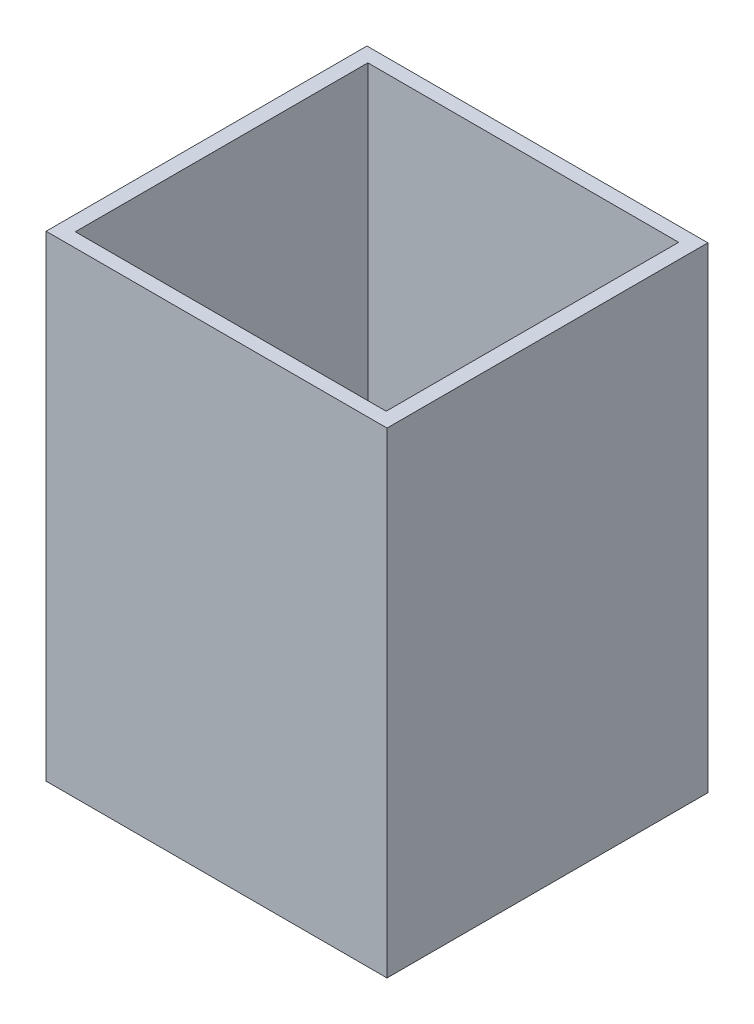
ISO-10303-21;
HEADER;
FILE_DESCRIPTION(('STEP AP214'),'2;1');
FILE_NAME('part.step','',(''),(''),'','','');
FILE_SCHEMA(('AUTOMOTIVE_DESIGN { 1 0 10303 214 1 1 1 1 }'));
ENDSEC;
DATA;
#1=APPLICATION_CONTEXT('core data for automotive mechanical design processes');
#2=APPLICATION_PROTOCOL_DEFINITION('international standard','automotive_design',2000,#1);
#3=PRODUCT_CONTEXT('',#1,'mechanical');
#4=PRODUCT('Part','Part','',(#3));
#5=PRODUCT_RELATED_PRODUCT_CATEGORY('part','',(#4));
#6=PRODUCT_DEFINITION_FORMATION('','',#4);
#7=PRODUCT_DEFINITION_CONTEXT('part definition',#1,'design');
#8=PRODUCT_DEFINITION('design','',#6,#7);
#9=PRODUCT_DEFINITION_SHAPE('','',#8);
#10=(LENGTH_UNIT() NAMED_UNIT(*) SI_UNIT(.MILLI.,.METRE.));
#11=(NAMED_UNIT(*) PLANE_ANGLE_UNIT() SI_UNIT($,.RADIAN.));
#12=(NAMED_UNIT(*) SI_UNIT($,.STERADIAN.) SOLID_ANGLE_UNIT());
#13=UNCERTAINTY_MEASURE_WITH_UNIT(LENGTH_MEASURE(1.E-05),#10,'distance_accuracy_value','');
#14=(GEOMETRIC_REPRESENTATION_CONTEXT(3) GLOBAL_UNCERTAINTY_ASSIGNED_CONTEXT((#13)) GLOBAL_UNIT_ASSIGNED_CONTEXT((#10,
#11,#12)) REPRESENTATION_CONTEXT('',''));
#15=CARTESIAN_POINT('',(0.,0.,0.));
#16=DIRECTION('',(0.,0.,1.));
#17=DIRECTION('',(1.,0.,0.));
#18=AXIS2_PLACEMENT_3D('',#15,#16,#17);
#19=CARTESIAN_POINT('',(34.,80.,-32.));
#20=DIRECTION('',(-1.,0.,0.));
#21=DIRECTION('',(0.,0.,1.));
#22=AXIS2_PLACEMENT_3D('',#19,#20,#21);
#23=PLANE('',#22);
#24=DIRECTION('',(0.,-1.,0.));
#25=VECTOR('',#24,1.);
#26=CARTESIAN_POINT('',(34.,80.,32.));
#27=LINE('',#26,#25);
#28=CARTESIAN_POINT('',(34.,80.,32.));
#29=VERTEX_POINT('',#28);
#30=CARTESIAN_POINT('',(34.,-15.,32.));
#31=VERTEX_POINT('',#30);
#32=EDGE_CURVE('E248',#29,#31,#27,.T.);
#33=ORIENTED_EDGE('',*,*,#32,.T.);
#34=DIRECTION('',(0.,0.,1.));
#35=VECTOR('',#34,1.);
#36=CARTESIAN_POINT('',(34.,-15.,-32.));
#37=LINE('',#36,#35);
#38=CARTESIAN_POINT('',(34.,-15.,-32.));
#39=VERTEX_POINT('',#38);
#40=EDGE_CURVE('E227',#39,#31,#37,.T.);
#41=ORIENTED_EDGE('',*,*,#40,.F.);
#42=DIRECTION('',(0.,-1.,0.));
#43=VECTOR('',#42,1.);
#44=CARTESIAN_POINT('',(34.,80.,-32.));
#45=LINE('',#44,#43);
#46=CARTESIAN_POINT('',(34.,80.,-32.));
#47=VERTEX_POINT('',#46);
#48=EDGE_CURVE('E11',#47,#39,#45,.T.);
#49=ORIENTED_EDGE('',*,*,#48,.F.);
#50=DIRECTION('',(0.,0.,-1.));
#51=VECTOR('',#50,1.);
#52=CARTESIAN_POINT('',(34.,80.,-32.));
#53=LINE('',#52,#51);
#54=EDGE_CURVE('E235',#29,#47,#53,.T.);
#55=ORIENTED_EDGE('',*,*,#54,.F.);
#56=EDGE_LOOP('',(#33,#41,#49,#55));
#57=FACE_BOUND('',#56,.T.);
#58=ADVANCED_FACE('F39',(#57),#23,.F.);
#59=CARTESIAN_POINT('',(-34.,80.,-32.));
#60=DIRECTION('',(0.,0.,1.));
#61=DIRECTION('',(1.,0.,0.));
#62=AXIS2_PLACEMENT_3D('',#59,#60,#61);
#63=PLANE('',#62);
#64=ORIENTED_EDGE('',*,*,#48,.T.);
#65=DIRECTION('',(1.,0.,0.));
#66=VECTOR('',#65,1.);
#67=CARTESIAN_POINT('',(34.,-15.,-32.));
#68=LINE('',#67,#66);
#69=CARTESIAN_POINT('',(-34.,-15.,-32.));
#70=VERTEX_POINT('',#69);
#71=EDGE_CURVE('E223',#70,#39,#68,.T.);
#72=ORIENTED_EDGE('',*,*,#71,.F.);
#73=DIRECTION('',(0.,-1.,0.));
#74=VECTOR('',#73,1.);
#75=CARTESIAN_POINT('',(-34.,80.,-32.));
#76=LINE('',#75,#74);
#77=CARTESIAN_POINT('',(-34.,80.,-32.));
#78=VERTEX_POINT('',#77);
#79=EDGE_CURVE('E47',#78,#70,#76,.T.);
#80=ORIENTED_EDGE('',*,*,#79,.F.);
#81=DIRECTION('',(-1.,0.,0.));
#82=VECTOR('',#81,1.);
#83=CARTESIAN_POINT('',(-34.,80.,-32.));
#84=LINE('',#83,#82);
#85=EDGE_CURVE('E239',#47,#78,#84,.T.);
#86=ORIENTED_EDGE('',*,*,#85,.F.);
#87=EDGE_LOOP('',(#64,#72,#80,#86));
#88=FACE_BOUND('',#87,.T.);
#89=ADVANCED_FACE('F262',(#88),#63,.F.);
#90=CARTESIAN_POINT('',(-34.,80.,-32.));
#91=DIRECTION('',(1.,0.,0.));
#92=DIRECTION('',(0.,0.,-1.));
#93=AXIS2_PLACEMENT_3D('',#90,#91,#92);
#94=PLANE('',#93);
#95=ORIENTED_EDGE('',*,*,#79,.T.);
#96=DIRECTION('',(0.,0.,-1.));
#97=VECTOR('',#96,1.);
#98=CARTESIAN_POINT('',(-34.,-15.,-32.));
#99=LINE('',#98,#97);
#100=CARTESIAN_POINT('',(-34.,-15.,32.));
#101=VERTEX_POINT('',#100);
#102=EDGE_CURVE('E219',#101,#70,#99,.T.);
#103=ORIENTED_EDGE('',*,*,#102,.F.);
#104=DIRECTION('',(0.,-1.,0.));
#105=VECTOR('',#104,1.);
#106=CARTESIAN_POINT('',(-34.,80.,32.));
#107=LINE('',#106,#105);
#108=CARTESIAN_POINT('',(-34.,80.,32.));
#109=VERTEX_POINT('',#108);
#110=EDGE_CURVE('E251',#109,#101,#107,.T.);
#111=ORIENTED_EDGE('',*,*,#110,.F.);
#112=DIRECTION('',(0.,0.,1.));
#113=VECTOR('',#112,1.);
#114=CARTESIAN_POINT('',(-34.,80.,-32.));
#115=LINE('',#114,#113);
#116=EDGE_CURVE('E242',#78,#109,#115,.T.);
#117=ORIENTED_EDGE('',*,*,#116,.F.);
#118=EDGE_LOOP('',(#95,#103,#111,#117));
#119=FACE_BOUND('',#118,.T.);
#120=ADVANCED_FACE('F259',(#119),#94,.F.);
#121=CARTESIAN_POINT('',(-34.,80.,32.));
#122=DIRECTION('',(0.,0.,-1.));
#123=DIRECTION('',(-1.,0.,0.));
#124=AXIS2_PLACEMENT_3D('',#121,#122,#123);
#125=PLANE('',#124);
#126=ORIENTED_EDGE('',*,*,#110,.T.);
#127=DIRECTION('',(-1.,0.,0.));
#128=VECTOR('',#127,1.);
#129=CARTESIAN_POINT('',(34.,-15.,32.));
#130=LINE('',#129,#128);
#131=EDGE_CURVE('E231',#31,#101,#130,.T.);
#132=ORIENTED_EDGE('',*,*,#131,.F.);
#133=ORIENTED_EDGE('',*,*,#32,.F.);
#134=DIRECTION('',(1.,0.,0.));
#135=VECTOR('',#134,1.);
#136=CARTESIAN_POINT('',(-34.,80.,32.));
#137=LINE('',#136,#135);
#138=EDGE_CURVE('E245',#109,#29,#137,.T.);
#139=ORIENTED_EDGE('',*,*,#138,.F.);
#140=EDGE_LOOP('',(#126,#132,#133,#139));
#141=FACE_BOUND('',#140,.T.);
#142=ADVANCED_FACE('F271',(#141),#125,.F.);
#143=CARTESIAN_POINT('',(0.,80.,0.));
#144=DIRECTION('',(0.,1.,0.));
#145=DIRECTION('',(0.,0.,1.));
#146=AXIS2_PLACEMENT_3D('',#143,#144,#145);
#147=PLANE('',#146);
#148=DIRECTION('',(0.,0.,1.));
#149=VECTOR('',#148,1.);
#150=CARTESIAN_POINT('',(-31.,80.,29.1764705882353));
#151=LINE('',#150,#149);
#152=CARTESIAN_POINT('',(-31.,80.,-29.1764705882353));
#153=VERTEX_POINT('',#152);
#154=CARTESIAN_POINT('',(-31.,80.,29.1764705882353));
#155=VERTEX_POINT('',#154);
#156=EDGE_CURVE('E54',#153,#155,#151,.T.);
#157=ORIENTED_EDGE('',*,*,#156,.F.);
#158=DIRECTION('',(-1.,0.,0.));
#159=VECTOR('',#158,1.);
#160=CARTESIAN_POINT('',(31.,80.,-29.1764705882353));
#161=LINE('',#160,#159);
#162=CARTESIAN_POINT('',(31.,80.,-29.1764705882353));
#163=VERTEX_POINT('',#162);
#164=EDGE_CURVE('E151',#163,#153,#161,.T.);
#165=ORIENTED_EDGE('',*,*,#164,.F.);
#166=DIRECTION('',(0.,0.,-1.));
#167=VECTOR('',#166,1.);
#168=CARTESIAN_POINT('',(31.,80.,29.1764705882353));
#169=LINE('',#168,#167);
#170=CARTESIAN_POINT('',(31.,80.,29.1764705882353));
#171=VERTEX_POINT('',#170);
#172=EDGE_CURVE('E155',#171,#163,#169,.T.);
#173=ORIENTED_EDGE('',*,*,#172,.F.);
#174=DIRECTION('',(1.,0.,0.));
#175=VECTOR('',#174,1.);
#176=CARTESIAN_POINT('',(31.,80.,29.1764705882353));
#177=LINE('',#176,#175);
#178=EDGE_CURVE('E164',#155,#171,#177,.T.);
#179=ORIENTED_EDGE('',*,*,#178,.F.);
#180=EDGE_LOOP('',(#157,#165,#173,#179));
#181=FACE_BOUND('',#180,.T.);
#182=ORIENTED_EDGE('',*,*,#54,.T.);
#183=ORIENTED_EDGE('',*,*,#85,.T.);
#184=ORIENTED_EDGE('',*,*,#116,.T.);
#185=ORIENTED_EDGE('',*,*,#138,.T.);
#186=EDGE_LOOP('',(#182,#183,#184,#185));
#187=FACE_BOUND('',#186,.T.);
#188=ADVANCED_FACE('F275',(#181,#187),#147,.T.);
#189=CARTESIAN_POINT('',(0.,-15.,0.));
#190=DIRECTION('',(0.,-1.,0.));
#191=DIRECTION('',(0.,0.,-1.));
#192=AXIS2_PLACEMENT_3D('',#189,#190,#191);
#193=PLANE('',#192);
#194=ORIENTED_EDGE('',*,*,#102,.T.);
#195=ORIENTED_EDGE('',*,*,#71,.T.);
#196=ORIENTED_EDGE('',*,*,#40,.T.);
#197=ORIENTED_EDGE('',*,*,#131,.T.);
#198=EDGE_LOOP('',(#194,#195,#196,#197));
#199=FACE_BOUND('',#198,.T.);
#200=DIRECTION('',(1.,0.,0.));
#201=VECTOR('',#200,1.);
#202=CARTESIAN_POINT('',(30.86,-15.,-29.0447058823529));
#203=LINE('',#202,#201);
#204=CARTESIAN_POINT('',(-30.86,-15.,-29.0447058823529));
#205=VERTEX_POINT('',#204);
#206=CARTESIAN_POINT('',(30.86,-15.,-29.0447058823529));
#207=VERTEX_POINT('',#206);
#208=EDGE_CURVE('E182',#205,#207,#203,.T.);
#209=ORIENTED_EDGE('',*,*,#208,.F.);
#210=DIRECTION('',(0.,0.,-1.));
#211=VECTOR('',#210,1.);
#212=CARTESIAN_POINT('',(-30.86,-15.,-29.0447058823529));
#213=LINE('',#212,#211);
#214=CARTESIAN_POINT('',(-30.86,-15.,29.0447058823529));
#215=VERTEX_POINT('',#214);
#216=EDGE_CURVE('E179',#215,#205,#213,.T.);
#217=ORIENTED_EDGE('',*,*,#216,.F.);
#218=DIRECTION('',(-1.,0.,0.));
#219=VECTOR('',#218,1.);
#220=CARTESIAN_POINT('',(30.86,-15.,29.0447058823529));
#221=LINE('',#220,#219);
#222=CARTESIAN_POINT('',(30.86,-15.,29.0447058823529));
#223=VERTEX_POINT('',#222);
#224=EDGE_CURVE('E190',#223,#215,#221,.T.);
#225=ORIENTED_EDGE('',*,*,#224,.F.);
#226=DIRECTION('',(0.,0.,1.));
#227=VECTOR('',#226,1.);
#228=CARTESIAN_POINT('',(30.86,-15.,-29.0447058823529));
#229=LINE('',#228,#227);
#230=EDGE_CURVE('E186',#207,#223,#229,.T.);
#231=ORIENTED_EDGE('',*,*,#230,.F.);
#232=EDGE_LOOP('',(#209,#217,#225,#231));
#233=FACE_BOUND('',#232,.T.);
#234=ADVANCED_FACE('F266',(#199,#233),#193,.T.);
#235=CARTESIAN_POINT('',(-30.86,-15.,-29.0447058823529));
#236=DIRECTION('',(1.,0.,0.));
#237=DIRECTION('',(0.,0.,-1.));
#238=AXIS2_PLACEMENT_3D('',#235,#236,#237);
#239=PLANE('',#238);
#240=DIRECTION('',(0.,0.,-1.));
#241=VECTOR('',#240,1.);
#242=CARTESIAN_POINT('',(-30.86,0.,-29.0447058823529));
#243=LINE('',#242,#241);
#244=CARTESIAN_POINT('',(-30.86,0.,29.0447058823529));
#245=VERTEX_POINT('',#244);
#246=CARTESIAN_POINT('',(-30.86,0.,-29.0447058823529));
#247=VERTEX_POINT('',#246);
#248=EDGE_CURVE('E173',#245,#247,#243,.T.);
#249=ORIENTED_EDGE('',*,*,#248,.F.);
#250=DIRECTION('',(0.,1.,0.));
#251=VECTOR('',#250,1.);
#252=CARTESIAN_POINT('',(-30.86,-15.,29.0447058823529));
#253=LINE('',#252,#251);
#254=EDGE_CURVE('E62',#215,#245,#253,.T.);
#255=ORIENTED_EDGE('',*,*,#254,.F.);
#256=ORIENTED_EDGE('',*,*,#216,.T.);
#257=DIRECTION('',(0.,1.,0.));
#258=VECTOR('',#257,1.);
#259=CARTESIAN_POINT('',(-30.86,-15.,-29.0447058823529));
#260=LINE('',#259,#258);
#261=EDGE_CURVE('E215',#205,#247,#260,.T.);
#262=ORIENTED_EDGE('',*,*,#261,.T.);
#263=EDGE_LOOP('',(#249,#255,#256,#262));
#264=FACE_BOUND('',#263,.T.);
#265=ADVANCED_FACE('F298',(#264),#239,.T.);
#266=CARTESIAN_POINT('',(30.86,-15.,-29.0447058823529));
#267=DIRECTION('',(0.,0.,1.));
#268=DIRECTION('',(1.,0.,0.));
#269=AXIS2_PLACEMENT_3D('',#266,#267,#268);
#270=PLANE('',#269);
#271=DIRECTION('',(1.,0.,0.));
#272=VECTOR('',#271,1.);
#273=CARTESIAN_POINT('',(30.86,0.,-29.0447058823529));
#274=LINE('',#273,#272);
#275=CARTESIAN_POINT('',(30.86,0.,-29.0447058823529));
#276=VERTEX_POINT('',#275);
#277=EDGE_CURVE('E196',#247,#276,#274,.T.);
#278=ORIENTED_EDGE('',*,*,#277,.F.);
#279=ORIENTED_EDGE('',*,*,#261,.F.);
#280=ORIENTED_EDGE('',*,*,#208,.T.);
#281=DIRECTION('',(0.,1.,0.));
#282=VECTOR('',#281,1.);
#283=CARTESIAN_POINT('',(30.86,-15.,-29.0447058823529));
#284=LINE('',#283,#282);
#285=EDGE_CURVE('E212',#207,#276,#284,.T.);
#286=ORIENTED_EDGE('',*,*,#285,.T.);
#287=EDGE_LOOP('',(#278,#279,#280,#286));
#288=FACE_BOUND('',#287,.T.);
#289=ADVANCED_FACE('F301',(#288),#270,.T.);
#290=CARTESIAN_POINT('',(30.86,-15.,-29.0447058823529));
#291=DIRECTION('',(-1.,0.,0.));
#292=DIRECTION('',(0.,0.,1.));
#293=AXIS2_PLACEMENT_3D('',#290,#291,#292);
#294=PLANE('',#293);
#295=DIRECTION('',(0.,0.,1.));
#296=VECTOR('',#295,1.);
#297=CARTESIAN_POINT('',(30.86,0.,-29.0447058823529));
#298=LINE('',#297,#296);
#299=CARTESIAN_POINT('',(30.86,0.,29.0447058823529));
#300=VERTEX_POINT('',#299);
#301=EDGE_CURVE('E200',#276,#300,#298,.T.);
#302=ORIENTED_EDGE('',*,*,#301,.F.);
#303=ORIENTED_EDGE('',*,*,#285,.F.);
#304=ORIENTED_EDGE('',*,*,#230,.T.);
#305=DIRECTION('',(0.,1.,0.));
#306=VECTOR('',#305,1.);
#307=CARTESIAN_POINT('',(30.86,-15.,29.0447058823529));
#308=LINE('',#307,#306);
#309=EDGE_CURVE('E209',#223,#300,#308,.T.);
#310=ORIENTED_EDGE('',*,*,#309,.T.);
#311=EDGE_LOOP('',(#302,#303,#304,#310));
#312=FACE_BOUND('',#311,.T.);
#313=ADVANCED_FACE('F305',(#312),#294,.T.);
#314=CARTESIAN_POINT('',(30.86,-15.,29.0447058823529));
#315=DIRECTION('',(0.,0.,-1.));
#316=DIRECTION('',(-1.,0.,0.));
#317=AXIS2_PLACEMENT_3D('',#314,#315,#316);
#318=PLANE('',#317);
#319=DIRECTION('',(-1.,0.,0.));
#320=VECTOR('',#319,1.);
#321=CARTESIAN_POINT('',(30.86,0.,29.0447058823529));
#322=LINE('',#321,#320);
#323=EDGE_CURVE('E183',#300,#245,#322,.T.);
#324=ORIENTED_EDGE('',*,*,#323,.F.);
#325=ORIENTED_EDGE('',*,*,#309,.F.);
#326=ORIENTED_EDGE('',*,*,#224,.T.);
#327=ORIENTED_EDGE('',*,*,#254,.T.);
#328=EDGE_LOOP('',(#324,#325,#326,#327));
#329=FACE_BOUND('',#328,.T.);
#330=ADVANCED_FACE('F291',(#329),#318,.T.);
#331=CARTESIAN_POINT('',(0.,0.,0.));
#332=DIRECTION('',(0.,1.,0.));
#333=DIRECTION('',(0.,0.,1.));
#334=AXIS2_PLACEMENT_3D('',#331,#332,#333);
#335=PLANE('',#334);
#336=ORIENTED_EDGE('',*,*,#323,.T.);
#337=ORIENTED_EDGE('',*,*,#248,.T.);
#338=ORIENTED_EDGE('',*,*,#277,.T.);
#339=ORIENTED_EDGE('',*,*,#301,.T.);
#340=EDGE_LOOP('',(#336,#337,#338,#339));
#341=FACE_BOUND('',#340,.T.);
#342=ADVANCED_FACE('F288',(#341),#335,.F.);
#343=CARTESIAN_POINT('',(-31.,5.,29.1764705882353));
#344=DIRECTION('',(-1.,0.,0.));
#345=DIRECTION('',(0.,0.,1.));
#346=AXIS2_PLACEMENT_3D('',#343,#344,#345);
#347=PLANE('',#346);
#348=ORIENTED_EDGE('',*,*,#156,.T.);
#349=DIRECTION('',(0.,1.,0.));
#350=VECTOR('',#349,1.);
#351=CARTESIAN_POINT('',(-31.,5.,29.1764705882353));
#352=LINE('',#351,#350);
#353=CARTESIAN_POINT('',(-31.,5.,29.1764705882353));
#354=VERTEX_POINT('',#353);
#355=EDGE_CURVE('E126',#354,#155,#352,.T.);
#356=ORIENTED_EDGE('',*,*,#355,.F.);
#357=DIRECTION('',(0.,0.,1.));
#358=VECTOR('',#357,1.);
#359=CARTESIAN_POINT('',(-31.,5.,29.1764705882353));
#360=LINE('',#359,#358);
#361=CARTESIAN_POINT('',(-31.,5.,-29.1764705882353));
#362=VERTEX_POINT('',#361);
#363=EDGE_CURVE('E130',#362,#354,#360,.T.);
#364=ORIENTED_EDGE('',*,*,#363,.F.);
#365=DIRECTION('',(0.,1.,0.));
#366=VECTOR('',#365,1.);
#367=CARTESIAN_POINT('',(-31.,5.,-29.1764705882353));
#368=LINE('',#367,#366);
#369=EDGE_CURVE('E170',#362,#153,#368,.T.);
#370=ORIENTED_EDGE('',*,*,#369,.T.);
#371=EDGE_LOOP('',(#348,#356,#364,#370));
#372=FACE_BOUND('',#371,.T.);
#373=ADVANCED_FACE('F128',(#372),#347,.F.);
#374=CARTESIAN_POINT('',(31.,5.,-29.1764705882353));
#375=DIRECTION('',(0.,0.,-1.));
#376=DIRECTION('',(-1.,0.,0.));
#377=AXIS2_PLACEMENT_3D('',#374,#375,#376);
#378=PLANE('',#377);
#379=ORIENTED_EDGE('',*,*,#164,.T.);
#380=ORIENTED_EDGE('',*,*,#369,.F.);
#381=DIRECTION('',(-1.,0.,0.));
#382=VECTOR('',#381,1.);
#383=CARTESIAN_POINT('',(31.,5.,-29.1764705882353));
#384=LINE('',#383,#382);
#385=CARTESIAN_POINT('',(31.,5.,-29.1764705882353));
#386=VERTEX_POINT('',#385);
#387=EDGE_CURVE('E137',#386,#362,#384,.T.);
#388=ORIENTED_EDGE('',*,*,#387,.F.);
#389=DIRECTION('',(0.,1.,0.));
#390=VECTOR('',#389,1.);
#391=CARTESIAN_POINT('',(31.,5.,-29.1764705882353));
#392=LINE('',#391,#390);
#393=EDGE_CURVE('E174',#386,#163,#392,.T.);
#394=ORIENTED_EDGE('',*,*,#393,.T.);
#395=EDGE_LOOP('',(#379,#380,#388,#394));
#396=FACE_BOUND('',#395,.T.);
#397=ADVANCED_FACE('F314',(#396),#378,.F.);
#398=CARTESIAN_POINT('',(31.,5.,29.1764705882353));
#399=DIRECTION('',(1.,0.,0.));
#400=DIRECTION('',(0.,0.,-1.));
#401=AXIS2_PLACEMENT_3D('',#398,#399,#400);
#402=PLANE('',#401);
#403=ORIENTED_EDGE('',*,*,#172,.T.);
#404=ORIENTED_EDGE('',*,*,#393,.F.);
#405=DIRECTION('',(0.,0.,-1.));
#406=VECTOR('',#405,1.);
#407=CARTESIAN_POINT('',(31.,5.,29.1764705882353));
#408=LINE('',#407,#406);
#409=CARTESIAN_POINT('',(31.,5.,29.1764705882353));
#410=VERTEX_POINT('',#409);
#411=EDGE_CURVE('E146',#410,#386,#408,.T.);
#412=ORIENTED_EDGE('',*,*,#411,.F.);
#413=DIRECTION('',(0.,1.,0.));
#414=VECTOR('',#413,1.);
#415=CARTESIAN_POINT('',(31.,5.,29.1764705882353));
#416=LINE('',#415,#414);
#417=EDGE_CURVE('E136',#410,#171,#416,.T.);
#418=ORIENTED_EDGE('',*,*,#417,.T.);
#419=EDGE_LOOP('',(#403,#404,#412,#418));
#420=FACE_BOUND('',#419,.T.);
#421=ADVANCED_FACE('F317',(#420),#402,.F.);
#422=CARTESIAN_POINT('',(31.,5.,29.1764705882353));
#423=DIRECTION('',(0.,0.,1.));
#424=DIRECTION('',(1.,0.,0.));
#425=AXIS2_PLACEMENT_3D('',#422,#423,#424);
#426=PLANE('',#425);
#427=ORIENTED_EDGE('',*,*,#178,.T.);
#428=ORIENTED_EDGE('',*,*,#417,.F.);
#429=DIRECTION('',(1.,0.,0.));
#430=VECTOR('',#429,1.);
#431=CARTESIAN_POINT('',(31.,5.,29.1764705882353));
#432=LINE('',#431,#430);
#433=EDGE_CURVE('E140',#354,#410,#432,.T.);
#434=ORIENTED_EDGE('',*,*,#433,.F.);
#435=ORIENTED_EDGE('',*,*,#355,.T.);
#436=EDGE_LOOP('',(#427,#428,#434,#435));
#437=FACE_BOUND('',#436,.T.);
#438=ADVANCED_FACE('F141',(#437),#426,.F.);
#439=CARTESIAN_POINT('',(0.,5.,0.));
#440=DIRECTION('',(0.,1.,0.));
#441=DIRECTION('',(0.,0.,1.));
#442=AXIS2_PLACEMENT_3D('',#439,#440,#441);
#443=PLANE('',#442);
#444=ORIENTED_EDGE('',*,*,#363,.T.);
#445=ORIENTED_EDGE('',*,*,#433,.T.);
#446=ORIENTED_EDGE('',*,*,#411,.T.);
#447=ORIENTED_EDGE('',*,*,#387,.T.);
#448=EDGE_LOOP('',(#444,#445,#446,#447));
#449=FACE_BOUND('',#448,.T.);
#450=ADVANCED_FACE('F148',(#449),#443,.T.);
#451=CLOSED_SHELL('',(#58,#89,#120,#142,#188,#234,#265,#289,#313,#330,#342,#373,#397,#421,#438,#450));
#452=MANIFOLD_SOLID_BREP('B2',#451);
#453=ADVANCED_BREP_SHAPE_REPRESENTATION('',(#18,#452),#14);
#454=SHAPE_DEFINITION_REPRESENTATION(#9,#453);
ENDSEC;
END-ISO-10303-21;
